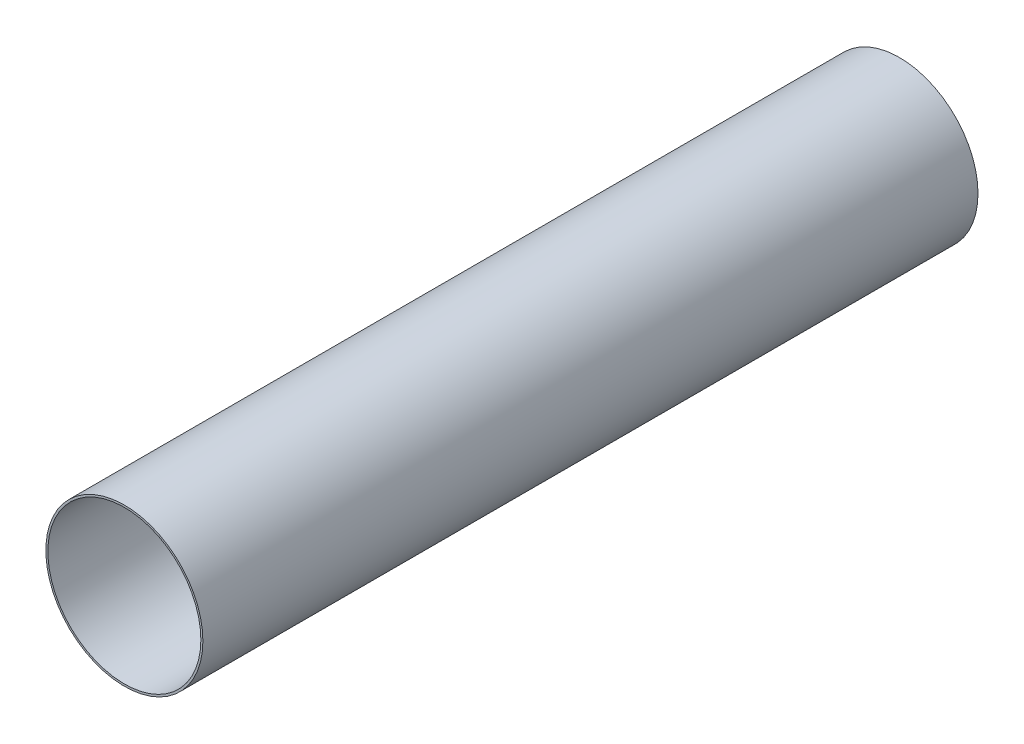
ISO-10303-21;
HEADER;
FILE_DESCRIPTION(('STEP AP214'),'2;1');
FILE_NAME('part.step','',(''),(''),'','','');
FILE_SCHEMA(('AUTOMOTIVE_DESIGN { 1 0 10303 214 1 1 1 1 }'));
ENDSEC;
DATA;
#1=APPLICATION_CONTEXT('core data for automotive mechanical design processes');
#2=APPLICATION_PROTOCOL_DEFINITION('international standard','automotive_design',2000,#1);
#3=PRODUCT_CONTEXT('',#1,'mechanical');
#4=PRODUCT('Part','Part','',(#3));
#5=PRODUCT_RELATED_PRODUCT_CATEGORY('part','',(#4));
#6=PRODUCT_DEFINITION_FORMATION('','',#4);
#7=PRODUCT_DEFINITION_CONTEXT('part definition',#1,'design');
#8=PRODUCT_DEFINITION('design','',#6,#7);
#9=PRODUCT_DEFINITION_SHAPE('','',#8);
#10=(LENGTH_UNIT() NAMED_UNIT(*) SI_UNIT(.MILLI.,.METRE.));
#11=(NAMED_UNIT(*) PLANE_ANGLE_UNIT() SI_UNIT($,.RADIAN.));
#12=(NAMED_UNIT(*) SI_UNIT($,.STERADIAN.) SOLID_ANGLE_UNIT());
#13=UNCERTAINTY_MEASURE_WITH_UNIT(LENGTH_MEASURE(1.E-05),#10,'distance_accuracy_value','');
#14=(GEOMETRIC_REPRESENTATION_CONTEXT(3) GLOBAL_UNCERTAINTY_ASSIGNED_CONTEXT((#13)) GLOBAL_UNIT_ASSIGNED_CONTEXT((#10,
#11,#12)) REPRESENTATION_CONTEXT('',''));
#15=CARTESIAN_POINT('',(0.,0.,0.));
#16=DIRECTION('',(0.,0.,1.));
#17=DIRECTION('',(1.,0.,0.));
#18=AXIS2_PLACEMENT_3D('',#15,#16,#17);
#19=CARTESIAN_POINT('',(0.,0.,770.));
#20=DIRECTION('',(0.,0.,1.));
#21=DIRECTION('',(1.,0.,0.));
#22=AXIS2_PLACEMENT_3D('',#19,#20,#21);
#23=PLANE('',#22);
#24=CARTESIAN_POINT('',(0.,0.,770.));
#25=DIRECTION('',(0.,0.,1.));
#26=DIRECTION('',(1.,0.,0.));
#27=AXIS2_PLACEMENT_3D('',#24,#25,#26);
#28=CIRCLE('',#27,78.);
#29=CARTESIAN_POINT('',(78.,0.,770.));
#30=VERTEX_POINT('',#29);
#31=EDGE_CURVE('E10',#30,#30,#28,.T.);
#32=ORIENTED_EDGE('',*,*,#31,.T.);
#33=EDGE_LOOP('',(#32));
#34=FACE_BOUND('',#33,.T.);
#35=CARTESIAN_POINT('',(0.,0.,770.));
#36=DIRECTION('',(0.,0.,1.));
#37=DIRECTION('',(1.,0.,0.));
#38=AXIS2_PLACEMENT_3D('',#35,#36,#37);
#39=CIRCLE('',#38,76.);
#40=CARTESIAN_POINT('',(76.,0.,770.));
#41=VERTEX_POINT('',#40);
#42=EDGE_CURVE('E50',#41,#41,#39,.T.);
#43=ORIENTED_EDGE('',*,*,#42,.F.);
#44=EDGE_LOOP('',(#43));
#45=FACE_BOUND('',#44,.T.);
#46=ADVANCED_FACE('F37',(#34,#45),#23,.T.);
#47=CARTESIAN_POINT('',(0.,0.,0.));
#48=DIRECTION('',(0.,0.,1.));
#49=DIRECTION('',(1.,0.,0.));
#50=AXIS2_PLACEMENT_3D('',#47,#48,#49);
#51=PLANE('',#50);
#52=CARTESIAN_POINT('',(0.,0.,0.));
#53=DIRECTION('',(0.,0.,1.));
#54=DIRECTION('',(1.,0.,0.));
#55=AXIS2_PLACEMENT_3D('',#52,#53,#54);
#56=CIRCLE('',#55,78.);
#57=CARTESIAN_POINT('',(78.,0.,0.));
#58=VERTEX_POINT('',#57);
#59=EDGE_CURVE('E41',#58,#58,#56,.T.);
#60=ORIENTED_EDGE('',*,*,#59,.F.);
#61=EDGE_LOOP('',(#60));
#62=FACE_BOUND('',#61,.T.);
#63=CARTESIAN_POINT('',(0.,0.,0.));
#64=DIRECTION('',(0.,0.,1.));
#65=DIRECTION('',(1.,0.,0.));
#66=AXIS2_PLACEMENT_3D('',#63,#64,#65);
#67=CIRCLE('',#66,76.);
#68=CARTESIAN_POINT('',(76.,0.,0.));
#69=VERTEX_POINT('',#68);
#70=EDGE_CURVE('E52',#69,#69,#67,.T.);
#71=ORIENTED_EDGE('',*,*,#70,.T.);
#72=EDGE_LOOP('',(#71));
#73=FACE_BOUND('',#72,.T.);
#74=ADVANCED_FACE('F64',(#62,#73),#51,.F.);
#75=CARTESIAN_POINT('',(0.,0.,770.));
#76=DIRECTION('',(0.,0.,-1.));
#77=DIRECTION('',(-1.,0.,0.));
#78=AXIS2_PLACEMENT_3D('',#75,#76,#77);
#79=CYLINDRICAL_SURFACE('',#78,78.);
#80=ORIENTED_EDGE('',*,*,#31,.F.);
#81=EDGE_LOOP('',(#80));
#82=FACE_BOUND('',#81,.T.);
#83=ORIENTED_EDGE('',*,*,#59,.T.);
#84=EDGE_LOOP('',(#83));
#85=FACE_BOUND('',#84,.T.);
#86=ADVANCED_FACE('F39',(#82,#85),#79,.T.);
#87=CARTESIAN_POINT('',(0.,0.,770.));
#88=DIRECTION('',(0.,0.,-1.));
#89=DIRECTION('',(-1.,0.,0.));
#90=AXIS2_PLACEMENT_3D('',#87,#88,#89);
#91=CYLINDRICAL_SURFACE('',#90,76.);
#92=ORIENTED_EDGE('',*,*,#42,.T.);
#93=EDGE_LOOP('',(#92));
#94=FACE_BOUND('',#93,.T.);
#95=ORIENTED_EDGE('',*,*,#70,.F.);
#96=EDGE_LOOP('',(#95));
#97=FACE_BOUND('',#96,.T.);
#98=ADVANCED_FACE('F60',(#94,#97),#91,.F.);
#99=CLOSED_SHELL('',(#46,#74,#86,#98));
#100=MANIFOLD_SOLID_BREP('B2',#99);
#101=ADVANCED_BREP_SHAPE_REPRESENTATION('',(#18,#100),#14);
#102=SHAPE_DEFINITION_REPRESENTATION(#9,#101);
ENDSEC;
END-ISO-10303-21;
